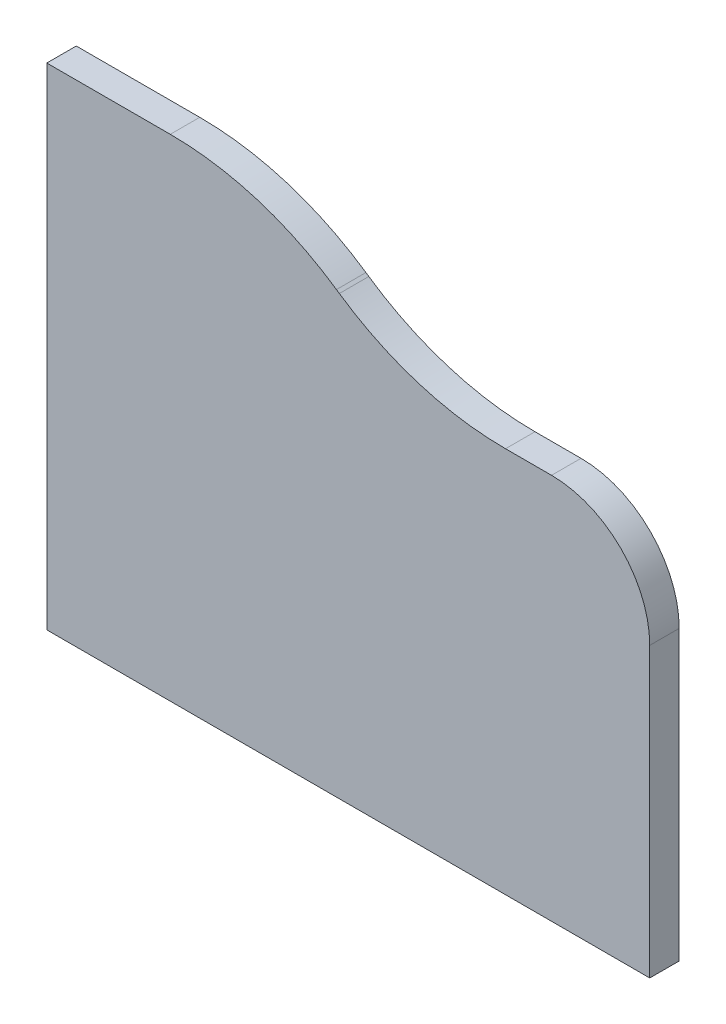
ISO-10303-21;
HEADER;
FILE_DESCRIPTION(('STEP AP214'),'2;1');
FILE_NAME('part.step','',(''),(''),'','','');
FILE_SCHEMA(('AUTOMOTIVE_DESIGN { 1 0 10303 214 1 1 1 1 }'));
ENDSEC;
DATA;
#1=APPLICATION_CONTEXT('core data for automotive mechanical design processes');
#2=APPLICATION_PROTOCOL_DEFINITION('international standard','automotive_design',2000,#1);
#3=PRODUCT_CONTEXT('',#1,'mechanical');
#4=PRODUCT('Part','Part','',(#3));
#5=PRODUCT_RELATED_PRODUCT_CATEGORY('part','',(#4));
#6=PRODUCT_DEFINITION_FORMATION('','',#4);
#7=PRODUCT_DEFINITION_CONTEXT('part definition',#1,'design');
#8=PRODUCT_DEFINITION('design','',#6,#7);
#9=PRODUCT_DEFINITION_SHAPE('','',#8);
#10=(LENGTH_UNIT() NAMED_UNIT(*) SI_UNIT(.MILLI.,.METRE.));
#11=(NAMED_UNIT(*) PLANE_ANGLE_UNIT() SI_UNIT($,.RADIAN.));
#12=(NAMED_UNIT(*) SI_UNIT($,.STERADIAN.) SOLID_ANGLE_UNIT());
#13=UNCERTAINTY_MEASURE_WITH_UNIT(LENGTH_MEASURE(1.E-05),#10,'distance_accuracy_value','');
#14=(GEOMETRIC_REPRESENTATION_CONTEXT(3) GLOBAL_UNCERTAINTY_ASSIGNED_CONTEXT((#13)) GLOBAL_UNIT_ASSIGNED_CONTEXT((#10,
#11,#12)) REPRESENTATION_CONTEXT('',''));
#15=CARTESIAN_POINT('',(0.,0.,0.));
#16=DIRECTION('',(0.,0.,1.));
#17=DIRECTION('',(1.,0.,0.));
#18=AXIS2_PLACEMENT_3D('',#15,#16,#17);
#19=CARTESIAN_POINT('',(31.7539586147963,113.677530068888,6.));
#20=DIRECTION('',(0.,0.,-1.));
#21=DIRECTION('',(-1.,0.,0.));
#22=AXIS2_PLACEMENT_3D('',#19,#20,#21);
#23=CYLINDRICAL_SURFACE('',#22,60.);
#24=CARTESIAN_POINT('',(31.7539586147963,113.677530068888,0.));
#25=DIRECTION('',(0.,0.,-1.));
#26=DIRECTION('',(1.,0.,0.));
#27=AXIS2_PLACEMENT_3D('',#24,#25,#26);
#28=CIRCLE('',#27,60.);
#29=CARTESIAN_POINT('',(31.7539586147965,53.6775300688882,0.));
#30=VERTEX_POINT('',#29);
#31=CARTESIAN_POINT('',(-2.09476318533354,64.1370008781597,0.));
#32=VERTEX_POINT('',#31);
#33=EDGE_CURVE('E146',#30,#32,#28,.T.);
#34=ORIENTED_EDGE('',*,*,#33,.T.);
#35=DIRECTION('',(0.,0.,-1.));
#36=VECTOR('',#35,1.);
#37=CARTESIAN_POINT('',(-2.09476318533354,64.1370008781597,6.));
#38=LINE('',#37,#36);
#39=CARTESIAN_POINT('',(-2.09476318533354,64.1370008781597,6.));
#40=VERTEX_POINT('',#39);
#41=EDGE_CURVE('E11',#40,#32,#38,.T.);
#42=ORIENTED_EDGE('',*,*,#41,.F.);
#43=CARTESIAN_POINT('',(31.7539586147963,113.677530068888,6.));
#44=DIRECTION('',(0.,0.,-1.));
#45=DIRECTION('',(1.,0.,0.));
#46=AXIS2_PLACEMENT_3D('',#43,#44,#45);
#47=CIRCLE('',#46,60.);
#48=CARTESIAN_POINT('',(31.7539586147965,53.6775300688882,6.));
#49=VERTEX_POINT('',#48);
#50=EDGE_CURVE('E171',#49,#40,#47,.T.);
#51=ORIENTED_EDGE('',*,*,#50,.F.);
#52=DIRECTION('',(0.,0.,-1.));
#53=VECTOR('',#52,1.);
#54=CARTESIAN_POINT('',(31.7539586147965,53.6775300688882,6.));
#55=LINE('',#54,#53);
#56=EDGE_CURVE('E142',#49,#30,#55,.T.);
#57=ORIENTED_EDGE('',*,*,#56,.T.);
#58=EDGE_LOOP('',(#34,#42,#51,#57));
#59=FACE_BOUND('',#58,.T.);
#60=ADVANCED_FACE('F39',(#59),#23,.F.);
#61=CARTESIAN_POINT('',(-2.68536173928009,64.5405291907284,6.));
#62=DIRECTION('',(-0.564145363335491,-0.825675486512144,0.));
#63=DIRECTION('',(0.825675486512145,-0.564145363335491,0.));
#64=AXIS2_PLACEMENT_3D('',#61,#62,#63);
#65=PLANE('',#64);
#66=DIRECTION('',(-0.825675486512144,0.564145363335491,0.));
#67=VECTOR('',#66,1.);
#68=CARTESIAN_POINT('',(-2.68536173928009,64.5405291907284,0.));
#69=LINE('',#68,#67);
#70=CARTESIAN_POINT('',(-2.68536173928009,64.5405291907284,0.));
#71=VERTEX_POINT('',#70);
#72=EDGE_CURVE('E150',#32,#71,#69,.T.);
#73=ORIENTED_EDGE('',*,*,#72,.T.);
#74=DIRECTION('',(0.,0.,-1.));
#75=VECTOR('',#74,1.);
#76=CARTESIAN_POINT('',(-2.68536173928009,64.5405291907284,6.));
#77=LINE('',#76,#75);
#78=CARTESIAN_POINT('',(-2.68536173928009,64.5405291907284,6.));
#79=VERTEX_POINT('',#78);
#80=EDGE_CURVE('E48',#79,#71,#77,.T.);
#81=ORIENTED_EDGE('',*,*,#80,.F.);
#82=DIRECTION('',(-0.825675486512144,0.564145363335491,0.));
#83=VECTOR('',#82,1.);
#84=CARTESIAN_POINT('',(-2.68536173928009,64.5405291907284,6.));
#85=LINE('',#84,#83);
#86=EDGE_CURVE('E102',#40,#79,#85,.T.);
#87=ORIENTED_EDGE('',*,*,#86,.F.);
#88=ORIENTED_EDGE('',*,*,#41,.T.);
#89=EDGE_LOOP('',(#73,#81,#87,#88));
#90=FACE_BOUND('',#89,.T.);
#91=ADVANCED_FACE('F227',(#90),#65,.F.);
#92=CARTESIAN_POINT('',(-36.5340835394099,15.,6.));
#93=DIRECTION('',(0.,0.,-1.));
#94=DIRECTION('',(-1.,0.,0.));
#95=AXIS2_PLACEMENT_3D('',#92,#93,#94);
#96=CYLINDRICAL_SURFACE('',#95,60.);
#97=CARTESIAN_POINT('',(-36.5340835394099,15.,0.));
#98=DIRECTION('',(0.,0.,1.));
#99=DIRECTION('',(-1.,0.,0.));
#100=AXIS2_PLACEMENT_3D('',#97,#98,#99);
#101=CIRCLE('',#100,60.);
#102=CARTESIAN_POINT('',(-36.5340835394101,75.,0.));
#103=VERTEX_POINT('',#102);
#104=EDGE_CURVE('E153',#71,#103,#101,.T.);
#105=ORIENTED_EDGE('',*,*,#104,.T.);
#106=DIRECTION('',(0.,0.,-1.));
#107=VECTOR('',#106,1.);
#108=CARTESIAN_POINT('',(-36.5340835394101,75.,6.));
#109=LINE('',#108,#107);
#110=CARTESIAN_POINT('',(-36.5340835394101,75.,6.));
#111=VERTEX_POINT('',#110);
#112=EDGE_CURVE('E186',#111,#103,#109,.T.);
#113=ORIENTED_EDGE('',*,*,#112,.F.);
#114=CARTESIAN_POINT('',(-36.5340835394099,15.,6.));
#115=DIRECTION('',(0.,0.,1.));
#116=DIRECTION('',(-1.,0.,0.));
#117=AXIS2_PLACEMENT_3D('',#114,#115,#116);
#118=CIRCLE('',#117,60.);
#119=EDGE_CURVE('E196',#79,#111,#118,.T.);
#120=ORIENTED_EDGE('',*,*,#119,.F.);
#121=ORIENTED_EDGE('',*,*,#80,.T.);
#122=EDGE_LOOP('',(#105,#113,#120,#121));
#123=FACE_BOUND('',#122,.T.);
#124=ADVANCED_FACE('F194',(#123),#96,.T.);
#125=CARTESIAN_POINT('',(-61.6878366970335,75.,6.));
#126=DIRECTION('',(0.,-1.,0.));
#127=DIRECTION('',(0.,0.,-1.));
#128=AXIS2_PLACEMENT_3D('',#125,#126,#127);
#129=PLANE('',#128);
#130=DIRECTION('',(-1.,0.,0.));
#131=VECTOR('',#130,1.);
#132=CARTESIAN_POINT('',(-61.6878366970335,75.,0.));
#133=LINE('',#132,#131);
#134=CARTESIAN_POINT('',(-61.6878366970335,75.,0.));
#135=VERTEX_POINT('',#134);
#136=EDGE_CURVE('E156',#103,#135,#133,.T.);
#137=ORIENTED_EDGE('',*,*,#136,.T.);
#138=DIRECTION('',(0.,0.,-1.));
#139=VECTOR('',#138,1.);
#140=CARTESIAN_POINT('',(-61.6878366970335,75.,6.));
#141=LINE('',#140,#139);
#142=CARTESIAN_POINT('',(-61.6878366970335,75.,6.));
#143=VERTEX_POINT('',#142);
#144=EDGE_CURVE('E182',#143,#135,#141,.T.);
#145=ORIENTED_EDGE('',*,*,#144,.F.);
#146=DIRECTION('',(-1.,0.,0.));
#147=VECTOR('',#146,1.);
#148=CARTESIAN_POINT('',(-61.6878366970335,75.,6.));
#149=LINE('',#148,#147);
#150=EDGE_CURVE('E213',#111,#143,#149,.T.);
#151=ORIENTED_EDGE('',*,*,#150,.F.);
#152=ORIENTED_EDGE('',*,*,#112,.T.);
#153=EDGE_LOOP('',(#137,#145,#151,#152));
#154=FACE_BOUND('',#153,.T.);
#155=ADVANCED_FACE('F205',(#154),#129,.F.);
#156=CARTESIAN_POINT('',(-61.6878366970335,-25.,6.));
#157=DIRECTION('',(1.,0.,0.));
#158=DIRECTION('',(0.,0.,-1.));
#159=AXIS2_PLACEMENT_3D('',#156,#157,#158);
#160=PLANE('',#159);
#161=DIRECTION('',(0.,-1.,0.));
#162=VECTOR('',#161,1.);
#163=CARTESIAN_POINT('',(-61.6878366970335,-25.,0.));
#164=LINE('',#163,#162);
#165=CARTESIAN_POINT('',(-61.6878366970335,-25.,0.));
#166=VERTEX_POINT('',#165);
#167=EDGE_CURVE('E159',#135,#166,#164,.T.);
#168=ORIENTED_EDGE('',*,*,#167,.T.);
#169=DIRECTION('',(0.,0.,-1.));
#170=VECTOR('',#169,1.);
#171=CARTESIAN_POINT('',(-61.6878366970335,-25.,6.));
#172=LINE('',#171,#170);
#173=CARTESIAN_POINT('',(-61.6878366970335,-25.,6.));
#174=VERTEX_POINT('',#173);
#175=EDGE_CURVE('E178',#174,#166,#172,.T.);
#176=ORIENTED_EDGE('',*,*,#175,.F.);
#177=DIRECTION('',(0.,-1.,0.));
#178=VECTOR('',#177,1.);
#179=CARTESIAN_POINT('',(-61.6878366970335,-25.,6.));
#180=LINE('',#179,#178);
#181=EDGE_CURVE('E211',#143,#174,#180,.T.);
#182=ORIENTED_EDGE('',*,*,#181,.F.);
#183=ORIENTED_EDGE('',*,*,#144,.T.);
#184=EDGE_LOOP('',(#168,#176,#182,#183));
#185=FACE_BOUND('',#184,.T.);
#186=ADVANCED_FACE('F209',(#185),#160,.F.);
#187=CARTESIAN_POINT('',(-61.6878366970335,-25.,6.));
#188=DIRECTION('',(0.,1.,0.));
#189=DIRECTION('',(0.,0.,1.));
#190=AXIS2_PLACEMENT_3D('',#187,#188,#189);
#191=PLANE('',#190);
#192=DIRECTION('',(1.,0.,0.));
#193=VECTOR('',#192,1.);
#194=CARTESIAN_POINT('',(-61.6878366970335,-25.,0.));
#195=LINE('',#194,#193);
#196=CARTESIAN_POINT('',(61.1277795129665,-25.,0.));
#197=VERTEX_POINT('',#196);
#198=EDGE_CURVE('E162',#166,#197,#195,.T.);
#199=ORIENTED_EDGE('',*,*,#198,.T.);
#200=DIRECTION('',(0.,0.,-1.));
#201=VECTOR('',#200,1.);
#202=CARTESIAN_POINT('',(61.1277795129665,-25.,6.));
#203=LINE('',#202,#201);
#204=CARTESIAN_POINT('',(61.1277795129665,-25.,6.));
#205=VERTEX_POINT('',#204);
#206=EDGE_CURVE('E135',#205,#197,#203,.T.);
#207=ORIENTED_EDGE('',*,*,#206,.F.);
#208=DIRECTION('',(1.,0.,0.));
#209=VECTOR('',#208,1.);
#210=CARTESIAN_POINT('',(-61.6878366970335,-25.,6.));
#211=LINE('',#210,#209);
#212=EDGE_CURVE('E124',#174,#205,#211,.T.);
#213=ORIENTED_EDGE('',*,*,#212,.F.);
#214=ORIENTED_EDGE('',*,*,#175,.T.);
#215=EDGE_LOOP('',(#199,#207,#213,#214));
#216=FACE_BOUND('',#215,.T.);
#217=ADVANCED_FACE('F239',(#216),#191,.F.);
#218=CARTESIAN_POINT('',(61.1277795129665,-25.,6.));
#219=DIRECTION('',(-1.,0.,0.));
#220=DIRECTION('',(0.,0.,1.));
#221=AXIS2_PLACEMENT_3D('',#218,#219,#220);
#222=PLANE('',#221);
#223=DIRECTION('',(0.,1.,0.));
#224=VECTOR('',#223,1.);
#225=CARTESIAN_POINT('',(61.1277795129665,-25.,0.));
#226=LINE('',#225,#224);
#227=CARTESIAN_POINT('',(61.1277795129665,33.677530068888,0.));
#228=VERTEX_POINT('',#227);
#229=EDGE_CURVE('E133',#197,#228,#226,.T.);
#230=ORIENTED_EDGE('',*,*,#229,.T.);
#231=DIRECTION('',(0.,0.,-1.));
#232=VECTOR('',#231,1.);
#233=CARTESIAN_POINT('',(61.1277795129665,33.677530068888,6.));
#234=LINE('',#233,#232);
#235=CARTESIAN_POINT('',(61.1277795129665,33.677530068888,6.));
#236=VERTEX_POINT('',#235);
#237=EDGE_CURVE('E130',#236,#228,#234,.T.);
#238=ORIENTED_EDGE('',*,*,#237,.F.);
#239=DIRECTION('',(0.,1.,0.));
#240=VECTOR('',#239,1.);
#241=CARTESIAN_POINT('',(61.1277795129665,-25.,6.));
#242=LINE('',#241,#240);
#243=EDGE_CURVE('E118',#205,#236,#242,.T.);
#244=ORIENTED_EDGE('',*,*,#243,.F.);
#245=ORIENTED_EDGE('',*,*,#206,.T.);
#246=EDGE_LOOP('',(#230,#238,#244,#245));
#247=FACE_BOUND('',#246,.T.);
#248=ADVANCED_FACE('F131',(#247),#222,.F.);
#249=CARTESIAN_POINT('',(41.1277795129665,33.6775300688882,6.));
#250=DIRECTION('',(0.,0.,-1.));
#251=DIRECTION('',(-1.,0.,0.));
#252=AXIS2_PLACEMENT_3D('',#249,#250,#251);
#253=CYLINDRICAL_SURFACE('',#252,20.);
#254=CARTESIAN_POINT('',(41.1277795129665,33.6775300688882,0.));
#255=DIRECTION('',(0.,0.,1.));
#256=DIRECTION('',(1.,0.,0.));
#257=AXIS2_PLACEMENT_3D('',#254,#255,#256);
#258=CIRCLE('',#257,20.);
#259=CARTESIAN_POINT('',(41.1277795129663,53.6775300688882,0.));
#260=VERTEX_POINT('',#259);
#261=EDGE_CURVE('E88',#228,#260,#258,.T.);
#262=ORIENTED_EDGE('',*,*,#261,.T.);
#263=DIRECTION('',(0.,0.,-1.));
#264=VECTOR('',#263,1.);
#265=CARTESIAN_POINT('',(41.1277795129663,53.6775300688882,6.));
#266=LINE('',#265,#264);
#267=CARTESIAN_POINT('',(41.1277795129663,53.6775300688882,6.));
#268=VERTEX_POINT('',#267);
#269=EDGE_CURVE('E136',#268,#260,#266,.T.);
#270=ORIENTED_EDGE('',*,*,#269,.F.);
#271=CARTESIAN_POINT('',(41.1277795129665,33.6775300688882,6.));
#272=DIRECTION('',(0.,0.,1.));
#273=DIRECTION('',(1.,0.,0.));
#274=AXIS2_PLACEMENT_3D('',#271,#272,#273);
#275=CIRCLE('',#274,20.);
#276=EDGE_CURVE('E122',#236,#268,#275,.T.);
#277=ORIENTED_EDGE('',*,*,#276,.F.);
#278=ORIENTED_EDGE('',*,*,#237,.T.);
#279=EDGE_LOOP('',(#262,#270,#277,#278));
#280=FACE_BOUND('',#279,.T.);
#281=ADVANCED_FACE('F138',(#280),#253,.T.);
#282=CARTESIAN_POINT('',(31.7539586147965,53.6775300688882,6.));
#283=DIRECTION('',(0.,-1.,0.));
#284=DIRECTION('',(0.,0.,-1.));
#285=AXIS2_PLACEMENT_3D('',#282,#283,#284);
#286=PLANE('',#285);
#287=DIRECTION('',(-1.,0.,0.));
#288=VECTOR('',#287,1.);
#289=CARTESIAN_POINT('',(31.7539586147965,53.6775300688882,0.));
#290=LINE('',#289,#288);
#291=EDGE_CURVE('E94',#260,#30,#290,.T.);
#292=ORIENTED_EDGE('',*,*,#291,.T.);
#293=ORIENTED_EDGE('',*,*,#56,.F.);
#294=DIRECTION('',(-1.,0.,0.));
#295=VECTOR('',#294,1.);
#296=CARTESIAN_POINT('',(31.7539586147965,53.6775300688882,6.));
#297=LINE('',#296,#295);
#298=EDGE_CURVE('E56',#268,#49,#297,.T.);
#299=ORIENTED_EDGE('',*,*,#298,.F.);
#300=ORIENTED_EDGE('',*,*,#269,.T.);
#301=EDGE_LOOP('',(#292,#293,#299,#300));
#302=FACE_BOUND('',#301,.T.);
#303=ADVANCED_FACE('F247',(#302),#286,.F.);
#304=CARTESIAN_POINT('',(31.7539586147963,113.677530068888,6.));
#305=DIRECTION('',(0.,0.,1.));
#306=DIRECTION('',(1.,0.,0.));
#307=AXIS2_PLACEMENT_3D('',#304,#305,#306);
#308=PLANE('',#307);
#309=ORIENTED_EDGE('',*,*,#50,.T.);
#310=ORIENTED_EDGE('',*,*,#86,.T.);
#311=ORIENTED_EDGE('',*,*,#119,.T.);
#312=ORIENTED_EDGE('',*,*,#150,.T.);
#313=ORIENTED_EDGE('',*,*,#181,.T.);
#314=ORIENTED_EDGE('',*,*,#212,.T.);
#315=ORIENTED_EDGE('',*,*,#243,.T.);
#316=ORIENTED_EDGE('',*,*,#276,.T.);
#317=ORIENTED_EDGE('',*,*,#298,.T.);
#318=EDGE_LOOP('',(#309,#310,#311,#312,#313,#314,#315,#316,#317));
#319=FACE_BOUND('',#318,.T.);
#320=ADVANCED_FACE('F120',(#319),#308,.T.);
#321=CARTESIAN_POINT('',(31.7539586147963,113.677530068888,0.));
#322=DIRECTION('',(0.,0.,1.));
#323=DIRECTION('',(1.,0.,0.));
#324=AXIS2_PLACEMENT_3D('',#321,#322,#323);
#325=PLANE('',#324);
#326=ORIENTED_EDGE('',*,*,#33,.F.);
#327=ORIENTED_EDGE('',*,*,#291,.F.);
#328=ORIENTED_EDGE('',*,*,#261,.F.);
#329=ORIENTED_EDGE('',*,*,#229,.F.);
#330=ORIENTED_EDGE('',*,*,#198,.F.);
#331=ORIENTED_EDGE('',*,*,#167,.F.);
#332=ORIENTED_EDGE('',*,*,#136,.F.);
#333=ORIENTED_EDGE('',*,*,#104,.F.);
#334=ORIENTED_EDGE('',*,*,#72,.F.);
#335=EDGE_LOOP('',(#326,#327,#328,#329,#330,#331,#332,#333,#334));
#336=FACE_BOUND('',#335,.T.);
#337=ADVANCED_FACE('F200',(#336),#325,.F.);
#338=CLOSED_SHELL('',(#60,#91,#124,#155,#186,#217,#248,#281,#303,#320,#337));
#339=MANIFOLD_SOLID_BREP('B2',#338);
#340=ADVANCED_BREP_SHAPE_REPRESENTATION('',(#18,#339),#14);
#341=SHAPE_DEFINITION_REPRESENTATION(#9,#340);
ENDSEC;
END-ISO-10303-21;
